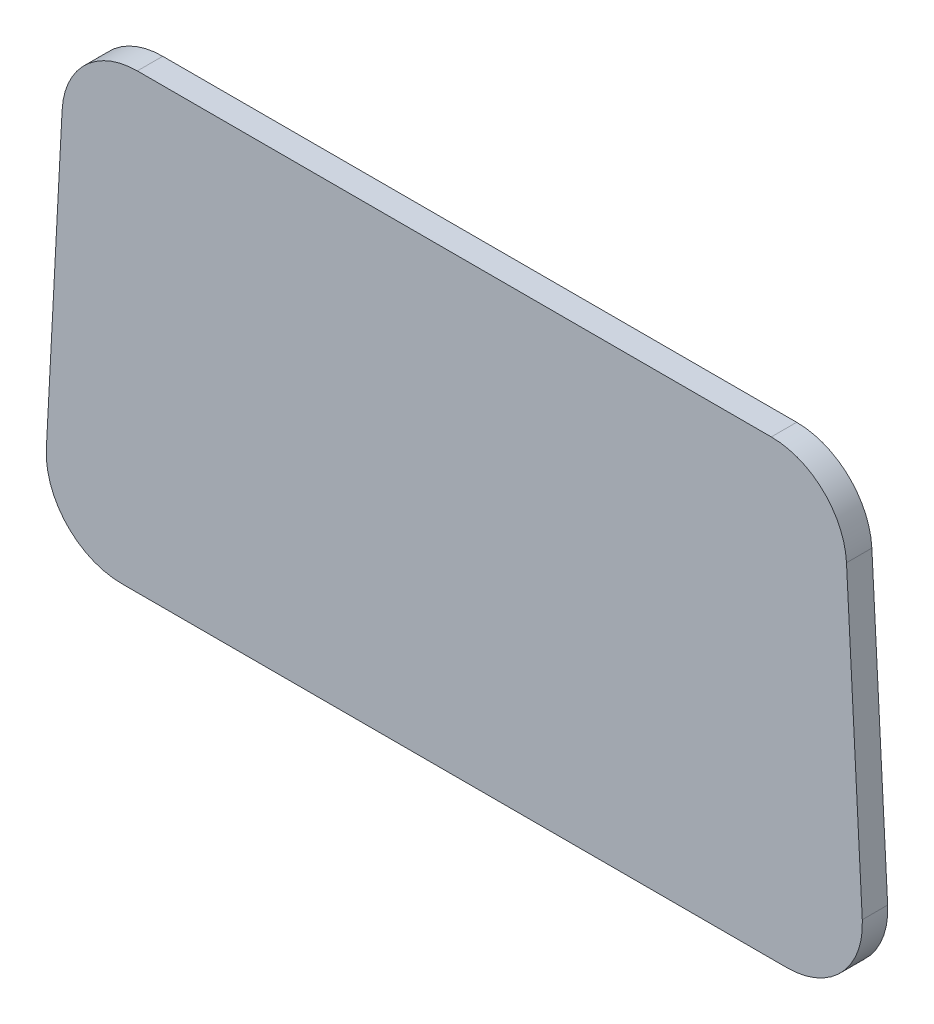
ISO-10303-21;
HEADER;
FILE_DESCRIPTION(('STEP AP214'),'2;1');
FILE_NAME('part.step','',(''),(''),'','','');
FILE_SCHEMA(('AUTOMOTIVE_DESIGN { 1 0 10303 214 1 1 1 1 }'));
ENDSEC;
DATA;
#1=APPLICATION_CONTEXT('core data for automotive mechanical design processes');
#2=APPLICATION_PROTOCOL_DEFINITION('international standard','automotive_design',2000,#1);
#3=PRODUCT_CONTEXT('',#1,'mechanical');
#4=PRODUCT('Part','Part','',(#3));
#5=PRODUCT_RELATED_PRODUCT_CATEGORY('part','',(#4));
#6=PRODUCT_DEFINITION_FORMATION('','',#4);
#7=PRODUCT_DEFINITION_CONTEXT('part definition',#1,'design');
#8=PRODUCT_DEFINITION('design','',#6,#7);
#9=PRODUCT_DEFINITION_SHAPE('','',#8);
#10=(LENGTH_UNIT() NAMED_UNIT(*) SI_UNIT(.MILLI.,.METRE.));
#11=(NAMED_UNIT(*) PLANE_ANGLE_UNIT() SI_UNIT($,.RADIAN.));
#12=(NAMED_UNIT(*) SI_UNIT($,.STERADIAN.) SOLID_ANGLE_UNIT());
#13=UNCERTAINTY_MEASURE_WITH_UNIT(LENGTH_MEASURE(1.E-05),#10,'distance_accuracy_value','');
#14=(GEOMETRIC_REPRESENTATION_CONTEXT(3) GLOBAL_UNCERTAINTY_ASSIGNED_CONTEXT((#13)) GLOBAL_UNIT_ASSIGNED_CONTEXT((#10,
#11,#12)) REPRESENTATION_CONTEXT('',''));
#15=CARTESIAN_POINT('',(0.,0.,0.));
#16=DIRECTION('',(0.,0.,1.));
#17=DIRECTION('',(1.,0.,0.));
#18=AXIS2_PLACEMENT_3D('',#15,#16,#17);
#19=CARTESIAN_POINT('',(-51.9872434191334,0.,3.2));
#20=DIRECTION('',(0.998629534754574,-0.0523359562429439,0.));
#21=DIRECTION('',(0.0523359562429439,0.998629534754574,0.));
#22=AXIS2_PLACEMENT_3D('',#19,#20,#21);
#23=PLANE('',#22);
#24=DIRECTION('',(-0.0523359562429439,-0.998629534754574,0.));
#25=VECTOR('',#24,1.);
#26=CARTESIAN_POINT('',(-51.9872434191334,0.,3.2));
#27=LINE('',#26,#25);
#28=CARTESIAN_POINT('',(-49.4718171963771,47.997191584308,3.2));
#29=VERTEX_POINT('',#28);
#30=CARTESIAN_POINT('',(-51.4633128091327,9.99719158430797,3.2));
#31=VERTEX_POINT('',#30);
#32=EDGE_CURVE('E100',#29,#31,#27,.T.);
#33=ORIENTED_EDGE('',*,*,#32,.F.);
#34=DIRECTION('',(0.,0.,-1.));
#35=VECTOR('',#34,1.);
#36=CARTESIAN_POINT('',(-49.4718171963771,47.997191584308,3.2));
#37=LINE('',#36,#35);
#38=CARTESIAN_POINT('',(-49.4718171963771,47.997191584308,0.));
#39=VERTEX_POINT('',#38);
#40=EDGE_CURVE('E85',#29,#39,#37,.T.);
#41=ORIENTED_EDGE('',*,*,#40,.T.);
#42=DIRECTION('',(-0.0523359562429439,-0.998629534754574,0.));
#43=VECTOR('',#42,1.);
#44=CARTESIAN_POINT('',(-51.9872434191334,0.,0.));
#45=LINE('',#44,#43);
#46=CARTESIAN_POINT('',(-51.4633128091327,9.99719158430797,0.));
#47=VERTEX_POINT('',#46);
#48=EDGE_CURVE('E97',#39,#47,#45,.T.);
#49=ORIENTED_EDGE('',*,*,#48,.T.);
#50=DIRECTION('',(0.,0.,-1.));
#51=VECTOR('',#50,1.);
#52=CARTESIAN_POINT('',(-51.4633128091327,9.99719158430797,3.2));
#53=LINE('',#52,#51);
#54=EDGE_CURVE('E102',#47,#31,#53,.F.);
#55=ORIENTED_EDGE('',*,*,#54,.T.);
#56=EDGE_LOOP('',(#33,#41,#49,#55));
#57=FACE_BOUND('',#56,.T.);
#58=ADVANCED_FACE('F15',(#57),#23,.F.);
#59=CARTESIAN_POINT('',(-51.9872434191334,0.,3.2));
#60=DIRECTION('',(0.,1.,0.));
#61=DIRECTION('',(-1.,0.,0.));
#62=AXIS2_PLACEMENT_3D('',#59,#60,#61);
#63=PLANE('',#62);
#64=DIRECTION('',(1.,0.,0.));
#65=VECTOR('',#64,1.);
#66=CARTESIAN_POINT('',(-51.9872434191334,0.,0.));
#67=LINE('',#66,#65);
#68=CARTESIAN_POINT('',(-41.9763322289642,0.,0.));
#69=VERTEX_POINT('',#68);
#70=CARTESIAN_POINT('',(41.9763322289642,0.,0.));
#71=VERTEX_POINT('',#70);
#72=EDGE_CURVE('E107',#69,#71,#67,.T.);
#73=ORIENTED_EDGE('',*,*,#72,.T.);
#74=DIRECTION('',(0.,0.,-1.));
#75=VECTOR('',#74,1.);
#76=CARTESIAN_POINT('',(41.9763322289642,0.,3.2));
#77=LINE('',#76,#75);
#78=CARTESIAN_POINT('',(41.9763322289642,0.,3.2));
#79=VERTEX_POINT('',#78);
#80=EDGE_CURVE('E10',#71,#79,#77,.F.);
#81=ORIENTED_EDGE('',*,*,#80,.T.);
#82=DIRECTION('',(1.,0.,0.));
#83=VECTOR('',#82,1.);
#84=CARTESIAN_POINT('',(-51.9872434191334,0.,3.2));
#85=LINE('',#84,#83);
#86=CARTESIAN_POINT('',(-41.9763322289642,0.,3.2));
#87=VERTEX_POINT('',#86);
#88=EDGE_CURVE('E146',#87,#79,#85,.T.);
#89=ORIENTED_EDGE('',*,*,#88,.F.);
#90=DIRECTION('',(0.,0.,-1.));
#91=VECTOR('',#90,1.);
#92=CARTESIAN_POINT('',(-41.9763322289642,0.,3.2));
#93=LINE('',#92,#91);
#94=EDGE_CURVE('E23',#87,#69,#93,.T.);
#95=ORIENTED_EDGE('',*,*,#94,.T.);
#96=EDGE_LOOP('',(#73,#81,#89,#95));
#97=FACE_BOUND('',#96,.T.);
#98=ADVANCED_FACE('F144',(#97),#63,.F.);
#99=CARTESIAN_POINT('',(51.9872434191334,0.,3.2));
#100=DIRECTION('',(-0.998629534754574,-0.0523359562429439,0.));
#101=DIRECTION('',(0.0523359562429439,-0.998629534754574,0.));
#102=AXIS2_PLACEMENT_3D('',#99,#100,#101);
#103=PLANE('',#102);
#104=DIRECTION('',(-0.0523359562429439,0.998629534754574,0.));
#105=VECTOR('',#104,1.);
#106=CARTESIAN_POINT('',(51.9872434191334,0.,0.));
#107=LINE('',#106,#105);
#108=CARTESIAN_POINT('',(51.4633128091327,9.99719158430797,0.));
#109=VERTEX_POINT('',#108);
#110=CARTESIAN_POINT('',(49.4718171963771,47.997191584308,0.));
#111=VERTEX_POINT('',#110);
#112=EDGE_CURVE('E115',#109,#111,#107,.T.);
#113=ORIENTED_EDGE('',*,*,#112,.T.);
#114=DIRECTION('',(0.,0.,-1.));
#115=VECTOR('',#114,1.);
#116=CARTESIAN_POINT('',(49.4718171963771,47.997191584308,3.2));
#117=LINE('',#116,#115);
#118=CARTESIAN_POINT('',(49.4718171963771,47.997191584308,3.2));
#119=VERTEX_POINT('',#118);
#120=EDGE_CURVE('E30',#111,#119,#117,.F.);
#121=ORIENTED_EDGE('',*,*,#120,.T.);
#122=DIRECTION('',(-0.0523359562429439,0.998629534754574,0.));
#123=VECTOR('',#122,1.);
#124=CARTESIAN_POINT('',(51.9872434191334,0.,3.2));
#125=LINE('',#124,#123);
#126=CARTESIAN_POINT('',(51.4633128091327,9.99719158430797,3.2));
#127=VERTEX_POINT('',#126);
#128=EDGE_CURVE('E154',#127,#119,#125,.T.);
#129=ORIENTED_EDGE('',*,*,#128,.F.);
#130=DIRECTION('',(0.,0.,-1.));
#131=VECTOR('',#130,1.);
#132=CARTESIAN_POINT('',(51.4633128091327,9.99719158430797,3.2));
#133=LINE('',#132,#131);
#134=EDGE_CURVE('E137',#127,#109,#133,.T.);
#135=ORIENTED_EDGE('',*,*,#134,.T.);
#136=EDGE_LOOP('',(#113,#121,#129,#135));
#137=FACE_BOUND('',#136,.T.);
#138=ADVANCED_FACE('F153',(#137),#103,.F.);
#139=CARTESIAN_POINT('',(-49.,57.,3.2));
#140=DIRECTION('',(0.,-1.,0.));
#141=DIRECTION('',(0.,0.,-1.));
#142=AXIS2_PLACEMENT_3D('',#139,#140,#141);
#143=PLANE('',#142);
#144=DIRECTION('',(-1.,0.,0.));
#145=VECTOR('',#144,1.);
#146=CARTESIAN_POINT('',(-49.,57.,0.));
#147=LINE('',#146,#145);
#148=CARTESIAN_POINT('',(39.9848366162086,57.,0.));
#149=VERTEX_POINT('',#148);
#150=CARTESIAN_POINT('',(-39.9848366162086,57.,0.));
#151=VERTEX_POINT('',#150);
#152=EDGE_CURVE('E119',#149,#151,#147,.T.);
#153=ORIENTED_EDGE('',*,*,#152,.T.);
#154=DIRECTION('',(0.,0.,-1.));
#155=VECTOR('',#154,1.);
#156=CARTESIAN_POINT('',(-39.9848366162086,57.,3.2));
#157=LINE('',#156,#155);
#158=CARTESIAN_POINT('',(-39.9848366162086,57.,3.2));
#159=VERTEX_POINT('',#158);
#160=EDGE_CURVE('E86',#151,#159,#157,.F.);
#161=ORIENTED_EDGE('',*,*,#160,.T.);
#162=DIRECTION('',(-1.,0.,0.));
#163=VECTOR('',#162,1.);
#164=CARTESIAN_POINT('',(-49.,57.,3.2));
#165=LINE('',#164,#163);
#166=CARTESIAN_POINT('',(39.9848366162086,57.,3.2));
#167=VERTEX_POINT('',#166);
#168=EDGE_CURVE('E121',#167,#159,#165,.T.);
#169=ORIENTED_EDGE('',*,*,#168,.F.);
#170=DIRECTION('',(0.,0.,-1.));
#171=VECTOR('',#170,1.);
#172=CARTESIAN_POINT('',(39.9848366162086,57.,3.2));
#173=LINE('',#172,#171);
#174=EDGE_CURVE('E91',#167,#149,#173,.T.);
#175=ORIENTED_EDGE('',*,*,#174,.T.);
#176=EDGE_LOOP('',(#153,#161,#169,#175));
#177=FACE_BOUND('',#176,.T.);
#178=ADVANCED_FACE('F167',(#177),#143,.F.);
#179=CARTESIAN_POINT('',(0.,0.,3.2));
#180=DIRECTION('',(0.,0.,1.));
#181=DIRECTION('',(1.,0.,0.));
#182=AXIS2_PLACEMENT_3D('',#179,#180,#181);
#183=PLANE('',#182);
#184=ORIENTED_EDGE('',*,*,#168,.T.);
#185=CARTESIAN_POINT('',(-39.9848366162086,47.5,3.2));
#186=DIRECTION('',(0.,0.,1.));
#187=DIRECTION('',(1.,0.,0.));
#188=AXIS2_PLACEMENT_3D('',#185,#186,#187);
#189=CIRCLE('',#188,9.5);
#190=EDGE_CURVE('E135',#159,#29,#189,.T.);
#191=ORIENTED_EDGE('',*,*,#190,.T.);
#192=ORIENTED_EDGE('',*,*,#32,.T.);
#193=CARTESIAN_POINT('',(-41.9763322289642,9.5,3.2));
#194=DIRECTION('',(0.,0.,1.));
#195=DIRECTION('',(1.,0.,0.));
#196=AXIS2_PLACEMENT_3D('',#193,#194,#195);
#197=CIRCLE('',#196,9.5);
#198=EDGE_CURVE('E130',#31,#87,#197,.T.);
#199=ORIENTED_EDGE('',*,*,#198,.T.);
#200=ORIENTED_EDGE('',*,*,#88,.T.);
#201=CARTESIAN_POINT('',(41.9763322289642,9.5,3.2));
#202=DIRECTION('',(0.,0.,1.));
#203=DIRECTION('',(1.,0.,0.));
#204=AXIS2_PLACEMENT_3D('',#201,#202,#203);
#205=CIRCLE('',#204,9.5);
#206=EDGE_CURVE('E37',#79,#127,#205,.T.);
#207=ORIENTED_EDGE('',*,*,#206,.T.);
#208=ORIENTED_EDGE('',*,*,#128,.T.);
#209=CARTESIAN_POINT('',(39.9848366162086,47.5,3.2));
#210=DIRECTION('',(0.,0.,1.));
#211=DIRECTION('',(1.,0.,0.));
#212=AXIS2_PLACEMENT_3D('',#209,#210,#211);
#213=CIRCLE('',#212,9.5);
#214=EDGE_CURVE('E133',#119,#167,#213,.T.);
#215=ORIENTED_EDGE('',*,*,#214,.T.);
#216=EDGE_LOOP('',(#184,#191,#192,#199,#200,#207,#208,#215));
#217=FACE_BOUND('',#216,.T.);
#218=ADVANCED_FACE('F172',(#217),#183,.T.);
#219=CARTESIAN_POINT('',(0.,0.,0.));
#220=DIRECTION('',(0.,0.,1.));
#221=DIRECTION('',(1.,0.,0.));
#222=AXIS2_PLACEMENT_3D('',#219,#220,#221);
#223=PLANE('',#222);
#224=ORIENTED_EDGE('',*,*,#48,.F.);
#225=CARTESIAN_POINT('',(-39.9848366162086,47.5,0.));
#226=DIRECTION('',(0.,0.,1.));
#227=DIRECTION('',(1.,0.,0.));
#228=AXIS2_PLACEMENT_3D('',#225,#226,#227);
#229=CIRCLE('',#228,9.5);
#230=EDGE_CURVE('E81',#39,#151,#229,.F.);
#231=ORIENTED_EDGE('',*,*,#230,.T.);
#232=ORIENTED_EDGE('',*,*,#152,.F.);
#233=CARTESIAN_POINT('',(39.9848366162086,47.5,0.));
#234=DIRECTION('',(0.,0.,1.));
#235=DIRECTION('',(1.,0.,0.));
#236=AXIS2_PLACEMENT_3D('',#233,#234,#235);
#237=CIRCLE('',#236,9.5);
#238=EDGE_CURVE('E92',#149,#111,#237,.F.);
#239=ORIENTED_EDGE('',*,*,#238,.T.);
#240=ORIENTED_EDGE('',*,*,#112,.F.);
#241=CARTESIAN_POINT('',(41.9763322289642,9.5,0.));
#242=DIRECTION('',(0.,0.,1.));
#243=DIRECTION('',(1.,0.,0.));
#244=AXIS2_PLACEMENT_3D('',#241,#242,#243);
#245=CIRCLE('',#244,9.5);
#246=EDGE_CURVE('E124',#109,#71,#245,.F.);
#247=ORIENTED_EDGE('',*,*,#246,.T.);
#248=ORIENTED_EDGE('',*,*,#72,.F.);
#249=CARTESIAN_POINT('',(-41.9763322289642,9.5,0.));
#250=DIRECTION('',(0.,0.,1.));
#251=DIRECTION('',(1.,0.,0.));
#252=AXIS2_PLACEMENT_3D('',#249,#250,#251);
#253=CIRCLE('',#252,9.5);
#254=EDGE_CURVE('E101',#69,#47,#253,.F.);
#255=ORIENTED_EDGE('',*,*,#254,.T.);
#256=EDGE_LOOP('',(#224,#231,#232,#239,#240,#247,#248,#255));
#257=FACE_BOUND('',#256,.T.);
#258=ADVANCED_FACE('F104',(#257),#223,.F.);
#259=CARTESIAN_POINT('',(-39.9848366162086,47.5,3.2));
#260=DIRECTION('',(0.,0.,-1.));
#261=DIRECTION('',(-1.,0.,0.));
#262=AXIS2_PLACEMENT_3D('',#259,#260,#261);
#263=CYLINDRICAL_SURFACE('',#262,9.5);
#264=ORIENTED_EDGE('',*,*,#190,.F.);
#265=ORIENTED_EDGE('',*,*,#160,.F.);
#266=ORIENTED_EDGE('',*,*,#230,.F.);
#267=ORIENTED_EDGE('',*,*,#40,.F.);
#268=EDGE_LOOP('',(#264,#265,#266,#267));
#269=FACE_BOUND('',#268,.T.);
#270=ADVANCED_FACE('F84',(#269),#263,.T.);
#271=CARTESIAN_POINT('',(39.9848366162086,47.5,3.2));
#272=DIRECTION('',(0.,0.,-1.));
#273=DIRECTION('',(-1.,0.,0.));
#274=AXIS2_PLACEMENT_3D('',#271,#272,#273);
#275=CYLINDRICAL_SURFACE('',#274,9.5);
#276=ORIENTED_EDGE('',*,*,#214,.F.);
#277=ORIENTED_EDGE('',*,*,#120,.F.);
#278=ORIENTED_EDGE('',*,*,#238,.F.);
#279=ORIENTED_EDGE('',*,*,#174,.F.);
#280=EDGE_LOOP('',(#276,#277,#278,#279));
#281=FACE_BOUND('',#280,.T.);
#282=ADVANCED_FACE('F171',(#281),#275,.T.);
#283=CARTESIAN_POINT('',(41.9763322289642,9.5,3.2));
#284=DIRECTION('',(0.,0.,-1.));
#285=DIRECTION('',(-1.,0.,0.));
#286=AXIS2_PLACEMENT_3D('',#283,#284,#285);
#287=CYLINDRICAL_SURFACE('',#286,9.5);
#288=ORIENTED_EDGE('',*,*,#206,.F.);
#289=ORIENTED_EDGE('',*,*,#80,.F.);
#290=ORIENTED_EDGE('',*,*,#246,.F.);
#291=ORIENTED_EDGE('',*,*,#134,.F.);
#292=EDGE_LOOP('',(#288,#289,#290,#291));
#293=FACE_BOUND('',#292,.T.);
#294=ADVANCED_FACE('F152',(#293),#287,.T.);
#295=CARTESIAN_POINT('',(-41.9763322289642,9.5,3.2));
#296=DIRECTION('',(0.,0.,-1.));
#297=DIRECTION('',(-1.,0.,0.));
#298=AXIS2_PLACEMENT_3D('',#295,#296,#297);
#299=CYLINDRICAL_SURFACE('',#298,9.5);
#300=ORIENTED_EDGE('',*,*,#198,.F.);
#301=ORIENTED_EDGE('',*,*,#54,.F.);
#302=ORIENTED_EDGE('',*,*,#254,.F.);
#303=ORIENTED_EDGE('',*,*,#94,.F.);
#304=EDGE_LOOP('',(#300,#301,#302,#303));
#305=FACE_BOUND('',#304,.T.);
#306=ADVANCED_FACE('F17',(#305),#299,.T.);
#307=CLOSED_SHELL('',(#58,#98,#138,#178,#218,#258,#270,#282,#294,#306));
#308=MANIFOLD_SOLID_BREP('B1',#307);
#309=ADVANCED_BREP_SHAPE_REPRESENTATION('',(#18,#308),#14);
#310=SHAPE_DEFINITION_REPRESENTATION(#9,#309);
ENDSEC;
END-ISO-10303-21;
